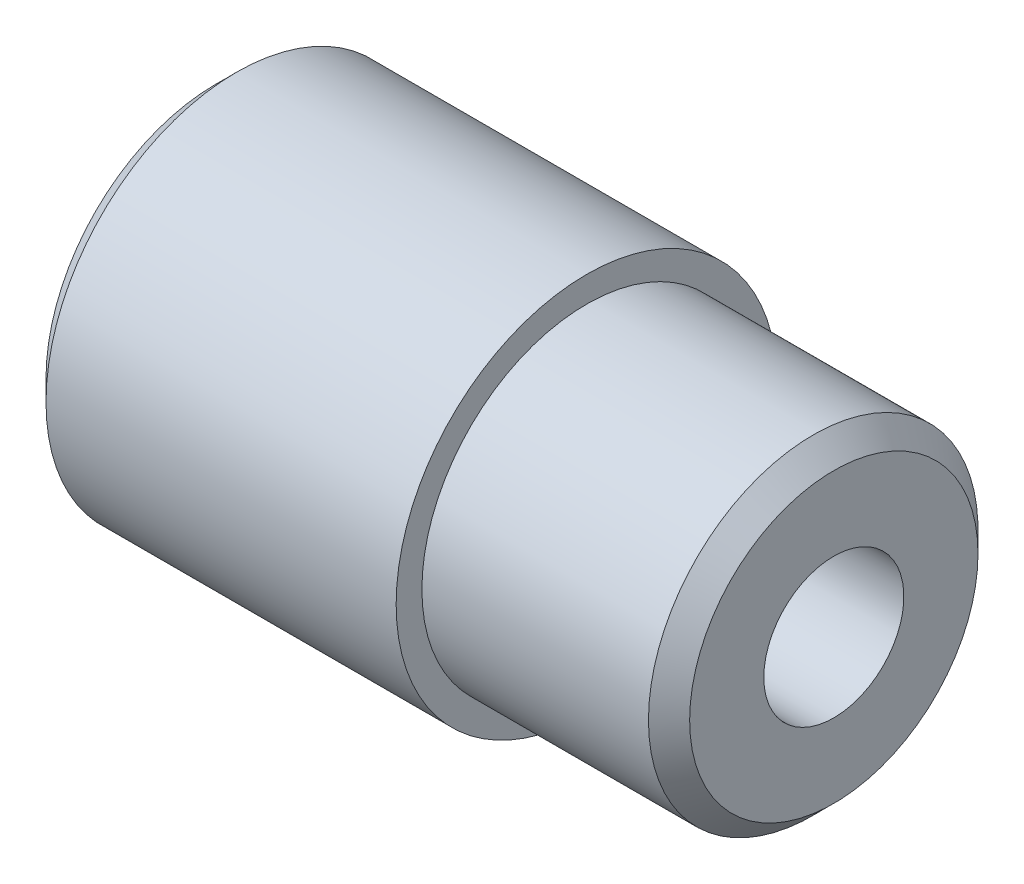
ISO-10303-21;
HEADER;
FILE_DESCRIPTION(('STEP AP214'),'2;1');
FILE_NAME('part.step','',(''),(''),'','','');
FILE_SCHEMA(('AUTOMOTIVE_DESIGN { 1 0 10303 214 1 1 1 1 }'));
ENDSEC;
DATA;
#1=APPLICATION_CONTEXT('core data for automotive mechanical design processes');
#2=APPLICATION_PROTOCOL_DEFINITION('international standard','automotive_design',2000,#1);
#3=PRODUCT_CONTEXT('',#1,'mechanical');
#4=PRODUCT('Part','Part','',(#3));
#5=PRODUCT_RELATED_PRODUCT_CATEGORY('part','',(#4));
#6=PRODUCT_DEFINITION_FORMATION('','',#4);
#7=PRODUCT_DEFINITION_CONTEXT('part definition',#1,'design');
#8=PRODUCT_DEFINITION('design','',#6,#7);
#9=PRODUCT_DEFINITION_SHAPE('','',#8);
#10=(LENGTH_UNIT() NAMED_UNIT(*) SI_UNIT(.MILLI.,.METRE.));
#11=(NAMED_UNIT(*) PLANE_ANGLE_UNIT() SI_UNIT($,.RADIAN.));
#12=(NAMED_UNIT(*) SI_UNIT($,.STERADIAN.) SOLID_ANGLE_UNIT());
#13=UNCERTAINTY_MEASURE_WITH_UNIT(LENGTH_MEASURE(1.E-05),#10,'distance_accuracy_value','');
#14=(GEOMETRIC_REPRESENTATION_CONTEXT(3) GLOBAL_UNCERTAINTY_ASSIGNED_CONTEXT((#13)) GLOBAL_UNIT_ASSIGNED_CONTEXT((#10,
#11,#12)) REPRESENTATION_CONTEXT('',''));
#15=CARTESIAN_POINT('',(0.,0.,0.));
#16=DIRECTION('',(0.,0.,1.));
#17=DIRECTION('',(1.,0.,0.));
#18=AXIS2_PLACEMENT_3D('',#15,#16,#17);
#19=CARTESIAN_POINT('',(0.,3.,0.));
#20=DIRECTION('',(1.,0.,0.));
#21=DIRECTION('',(0.,0.,-1.));
#22=AXIS2_PLACEMENT_3D('',#19,#20,#21);
#23=PLANE('',#22);
#24=CARTESIAN_POINT('',(0.,0.,0.));
#25=DIRECTION('',(1.,0.,0.));
#26=DIRECTION('',(0.,0.,-1.));
#27=AXIS2_PLACEMENT_3D('',#24,#25,#26);
#28=CIRCLE('',#27,8.25);
#29=CARTESIAN_POINT('',(0.,0.,-8.25));
#30=VERTEX_POINT('',#29);
#31=EDGE_CURVE('E68',#30,#30,#28,.F.);
#32=ORIENTED_EDGE('',*,*,#31,.T.);
#33=EDGE_LOOP('',(#32));
#34=FACE_BOUND('',#33,.T.);
#35=CARTESIAN_POINT('',(0.,0.,0.));
#36=DIRECTION('',(-1.,0.,0.));
#37=DIRECTION('',(0.,0.,1.));
#38=AXIS2_PLACEMENT_3D('',#35,#36,#37);
#39=CIRCLE('',#38,3.4);
#40=CARTESIAN_POINT('',(0.,0.,3.4));
#41=VERTEX_POINT('',#40);
#42=EDGE_CURVE('E86',#41,#41,#39,.T.);
#43=ORIENTED_EDGE('',*,*,#42,.F.);
#44=EDGE_LOOP('',(#43));
#45=FACE_BOUND('',#44,.T.);
#46=ADVANCED_FACE('F47',(#34,#45),#23,.F.);
#47=CARTESIAN_POINT('',(0.,0.,0.));
#48=DIRECTION('',(-1.,0.,0.));
#49=DIRECTION('',(0.,0.,1.));
#50=AXIS2_PLACEMENT_3D('',#47,#48,#49);
#51=CYLINDRICAL_SURFACE('',#50,9.25);
#52=CARTESIAN_POINT('',(1.00000000000001,0.,0.));
#53=DIRECTION('',(1.,0.,0.));
#54=DIRECTION('',(0.,0.,-1.));
#55=AXIS2_PLACEMENT_3D('',#52,#53,#54);
#56=CIRCLE('',#55,9.25);
#57=CARTESIAN_POINT('',(1.00000000000001,0.,-9.25));
#58=VERTEX_POINT('',#57);
#59=EDGE_CURVE('E62',#58,#58,#56,.T.);
#60=ORIENTED_EDGE('',*,*,#59,.T.);
#61=EDGE_LOOP('',(#60));
#62=FACE_BOUND('',#61,.T.);
#63=CARTESIAN_POINT('',(18.,0.,0.));
#64=DIRECTION('',(-1.,0.,0.));
#65=DIRECTION('',(0.,0.,1.));
#66=AXIS2_PLACEMENT_3D('',#63,#64,#65);
#67=CIRCLE('',#66,9.25);
#68=CARTESIAN_POINT('',(18.,0.,9.25));
#69=VERTEX_POINT('',#68);
#70=EDGE_CURVE('E74',#69,#69,#67,.T.);
#71=ORIENTED_EDGE('',*,*,#70,.T.);
#72=EDGE_LOOP('',(#71));
#73=FACE_BOUND('',#72,.T.);
#74=ADVANCED_FACE('F95',(#62,#73),#51,.T.);
#75=CARTESIAN_POINT('',(18.,9.25,0.));
#76=DIRECTION('',(-1.,0.,0.));
#77=DIRECTION('',(0.,0.,1.));
#78=AXIS2_PLACEMENT_3D('',#75,#76,#77);
#79=PLANE('',#78);
#80=ORIENTED_EDGE('',*,*,#70,.F.);
#81=EDGE_LOOP('',(#80));
#82=FACE_BOUND('',#81,.T.);
#83=CARTESIAN_POINT('',(18.,0.,0.));
#84=DIRECTION('',(-1.,0.,0.));
#85=DIRECTION('',(0.,0.,1.));
#86=AXIS2_PLACEMENT_3D('',#83,#84,#85);
#87=CIRCLE('',#86,8.);
#88=CARTESIAN_POINT('',(18.,0.,8.));
#89=VERTEX_POINT('',#88);
#90=EDGE_CURVE('E78',#89,#89,#87,.T.);
#91=ORIENTED_EDGE('',*,*,#90,.T.);
#92=EDGE_LOOP('',(#91));
#93=FACE_BOUND('',#92,.T.);
#94=ADVANCED_FACE('F102',(#82,#93),#79,.F.);
#95=CARTESIAN_POINT('',(0.,0.,0.));
#96=DIRECTION('',(-1.,0.,0.));
#97=DIRECTION('',(0.,0.,1.));
#98=AXIS2_PLACEMENT_3D('',#95,#96,#97);
#99=CYLINDRICAL_SURFACE('',#98,8.);
#100=CARTESIAN_POINT('',(29.,0.,0.));
#101=DIRECTION('',(-1.,0.,0.));
#102=DIRECTION('',(0.,0.,1.));
#103=AXIS2_PLACEMENT_3D('',#100,#101,#102);
#104=CIRCLE('',#103,8.);
#105=CARTESIAN_POINT('',(29.,0.,8.));
#106=VERTEX_POINT('',#105);
#107=EDGE_CURVE('E56',#106,#106,#104,.T.);
#108=ORIENTED_EDGE('',*,*,#107,.T.);
#109=EDGE_LOOP('',(#108));
#110=FACE_BOUND('',#109,.T.);
#111=ORIENTED_EDGE('',*,*,#90,.F.);
#112=EDGE_LOOP('',(#111));
#113=FACE_BOUND('',#112,.T.);
#114=ADVANCED_FACE('F129',(#110,#113),#99,.T.);
#115=CARTESIAN_POINT('',(30.,8.,0.));
#116=DIRECTION('',(-1.,0.,0.));
#117=DIRECTION('',(0.,0.,1.));
#118=AXIS2_PLACEMENT_3D('',#115,#116,#117);
#119=PLANE('',#118);
#120=CARTESIAN_POINT('',(30.,0.,0.));
#121=DIRECTION('',(-1.,0.,0.));
#122=DIRECTION('',(0.,0.,1.));
#123=AXIS2_PLACEMENT_3D('',#120,#121,#122);
#124=CIRCLE('',#123,7.);
#125=CARTESIAN_POINT('',(30.,0.,7.));
#126=VERTEX_POINT('',#125);
#127=EDGE_CURVE('E10',#126,#126,#124,.F.);
#128=ORIENTED_EDGE('',*,*,#127,.T.);
#129=EDGE_LOOP('',(#128));
#130=FACE_BOUND('',#129,.T.);
#131=CARTESIAN_POINT('',(30.,0.,0.));
#132=DIRECTION('',(-1.,0.,0.));
#133=DIRECTION('',(0.,0.,1.));
#134=AXIS2_PLACEMENT_3D('',#131,#132,#133);
#135=CIRCLE('',#134,3.39999999999999);
#136=CARTESIAN_POINT('',(30.,0.,3.39999999999999));
#137=VERTEX_POINT('',#136);
#138=EDGE_CURVE('E82',#137,#137,#135,.T.);
#139=ORIENTED_EDGE('',*,*,#138,.T.);
#140=EDGE_LOOP('',(#139));
#141=FACE_BOUND('',#140,.T.);
#142=ADVANCED_FACE('F118',(#130,#141),#119,.F.);
#143=CARTESIAN_POINT('',(0.,0.,0.));
#144=DIRECTION('',(-1.,0.,0.));
#145=DIRECTION('',(0.,0.,1.));
#146=AXIS2_PLACEMENT_3D('',#143,#144,#145);
#147=CYLINDRICAL_SURFACE('',#146,3.4);
#148=ORIENTED_EDGE('',*,*,#138,.F.);
#149=EDGE_LOOP('',(#148));
#150=FACE_BOUND('',#149,.T.);
#151=ORIENTED_EDGE('',*,*,#42,.T.);
#152=EDGE_LOOP('',(#151));
#153=FACE_BOUND('',#152,.T.);
#154=ADVANCED_FACE('F92',(#150,#153),#147,.F.);
#155=CARTESIAN_POINT('',(0.,0.,0.));
#156=DIRECTION('',(1.,0.,0.));
#157=DIRECTION('',(0.,0.,-1.));
#158=AXIS2_PLACEMENT_3D('',#155,#156,#157);
#159=CONICAL_SURFACE('',#158,8.25,0.785398163397445);
#160=ORIENTED_EDGE('',*,*,#59,.F.);
#161=EDGE_LOOP('',(#160));
#162=FACE_BOUND('',#161,.T.);
#163=ORIENTED_EDGE('',*,*,#31,.F.);
#164=EDGE_LOOP('',(#163));
#165=FACE_BOUND('',#164,.T.);
#166=ADVANCED_FACE('F107',(#162,#165),#159,.T.);
#167=CARTESIAN_POINT('',(29.,0.,0.));
#168=DIRECTION('',(-1.,0.,0.));
#169=DIRECTION('',(0.,0.,1.));
#170=AXIS2_PLACEMENT_3D('',#167,#168,#169);
#171=CONICAL_SURFACE('',#170,8.,0.78539816339745);
#172=ORIENTED_EDGE('',*,*,#127,.F.);
#173=EDGE_LOOP('',(#172));
#174=FACE_BOUND('',#173,.T.);
#175=ORIENTED_EDGE('',*,*,#107,.F.);
#176=EDGE_LOOP('',(#175));
#177=FACE_BOUND('',#176,.T.);
#178=ADVANCED_FACE('F50',(#174,#177),#171,.T.);
#179=CLOSED_SHELL('',(#46,#74,#94,#114,#142,#154,#166,#178));
#180=MANIFOLD_SOLID_BREP('B2',#179);
#181=ADVANCED_BREP_SHAPE_REPRESENTATION('',(#18,#180),#14);
#182=SHAPE_DEFINITION_REPRESENTATION(#9,#181);
ENDSEC;
END-ISO-10303-21;
